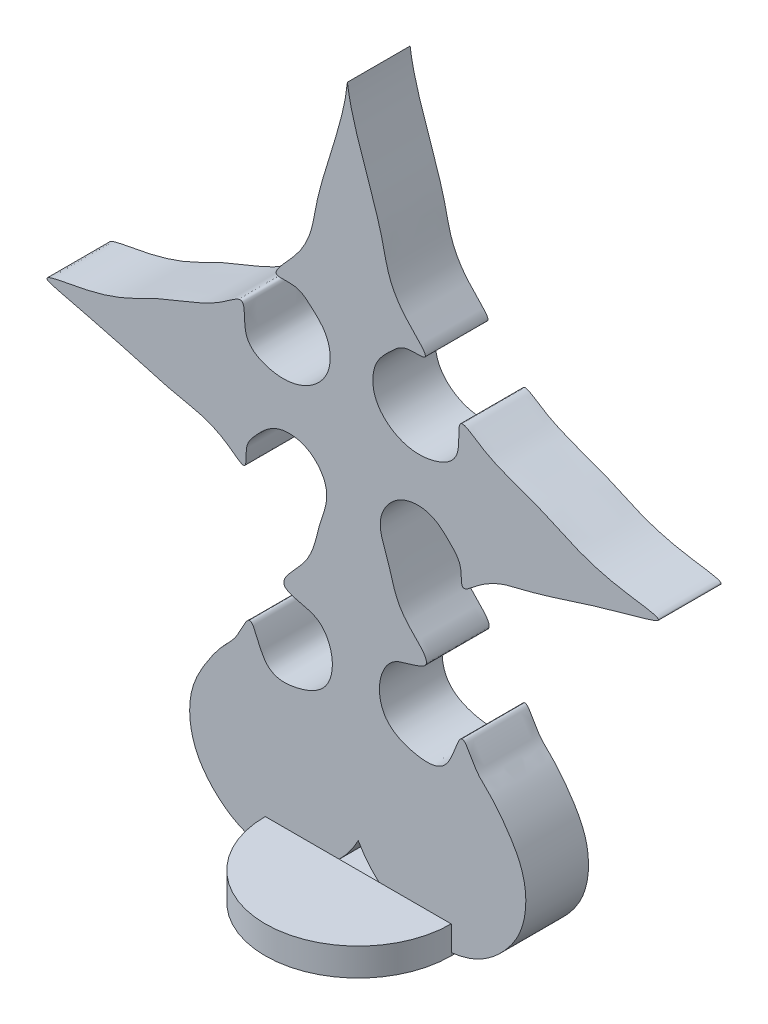
ISO-10303-21;
HEADER;
FILE_DESCRIPTION(('STEP AP214'),'2;1');
FILE_NAME('part.step','',(''),(''),'','','');
FILE_SCHEMA(('AUTOMOTIVE_DESIGN { 1 0 10303 214 1 1 1 1 }'));
ENDSEC;
DATA;
#1=APPLICATION_CONTEXT('core data for automotive mechanical design processes');
#2=APPLICATION_PROTOCOL_DEFINITION('international standard','automotive_design',2000,#1);
#3=PRODUCT_CONTEXT('',#1,'mechanical');
#4=PRODUCT('Part','Part','',(#3));
#5=PRODUCT_RELATED_PRODUCT_CATEGORY('part','',(#4));
#6=PRODUCT_DEFINITION_FORMATION('','',#4);
#7=PRODUCT_DEFINITION_CONTEXT('part definition',#1,'design');
#8=PRODUCT_DEFINITION('design','',#6,#7);
#9=PRODUCT_DEFINITION_SHAPE('','',#8);
#10=(LENGTH_UNIT() NAMED_UNIT(*) SI_UNIT(.MILLI.,.METRE.));
#11=(NAMED_UNIT(*) PLANE_ANGLE_UNIT() SI_UNIT($,.RADIAN.));
#12=(NAMED_UNIT(*) SI_UNIT($,.STERADIAN.) SOLID_ANGLE_UNIT());
#13=UNCERTAINTY_MEASURE_WITH_UNIT(LENGTH_MEASURE(1.E-05),#10,'distance_accuracy_value','');
#14=(GEOMETRIC_REPRESENTATION_CONTEXT(3) GLOBAL_UNCERTAINTY_ASSIGNED_CONTEXT((#13)) GLOBAL_UNIT_ASSIGNED_CONTEXT((#10,
#11,#12)) REPRESENTATION_CONTEXT('',''));
#15=CARTESIAN_POINT('',(0.,0.,0.));
#16=DIRECTION('',(0.,0.,1.));
#17=DIRECTION('',(1.,0.,0.));
#18=AXIS2_PLACEMENT_3D('',#15,#16,#17);
#19=CARTESIAN_POINT('',(-2.3460589924992,67.9005937561883,9.49282314499069));
#20=CARTESIAN_POINT('',(-2.95517138806825,61.44575257262,9.49282314499069));
#21=CARTESIAN_POINT('',(-7.75262932540256,50.6532373488072,9.49282314499069));
#22=CARTESIAN_POINT('',(-8.31635708686158,40.6967952727201,9.49282314499069));
#23=CARTESIAN_POINT('',(-16.0326186965979,33.7697083925186,9.49282314499069));
#24=CARTESIAN_POINT('',(-10.6596714627427,34.7837020859185,9.49282314499069));
#25=CARTESIAN_POINT('',(-8.25497269371805,32.6938123368539,9.49282314499069));
#26=CARTESIAN_POINT('',(-5.24318254140123,30.0194877075942,9.49282314499069));
#27=CARTESIAN_POINT('',(-4.76314986308724,24.2618958431138,9.49282314499069));
#28=CARTESIAN_POINT('',(-9.65646749749868,20.0113175271098,9.49282314499069));
#29=CARTESIAN_POINT('',(-15.4052762966303,20.0134316688476,9.49282314499069));
#30=CARTESIAN_POINT('',(-20.0454718472213,22.6736930282064,9.49282314499069));
#31=CARTESIAN_POINT('',(-18.846763472696,29.1020712023789,9.49282314499069));
#32=CARTESIAN_POINT('',(-22.2944338381779,26.5961578421053,9.49282314499069));
#33=CARTESIAN_POINT('',(-25.9790619184153,24.1569941839957,9.49282314499069));
#34=CARTESIAN_POINT('',(-35.5778296219317,20.9877590064459,9.49282314499069));
#35=CARTESIAN_POINT('',(-40.5608869217253,17.0166202355323,9.49282314499069));
#36=CARTESIAN_POINT('',(-53.9991171827852,15.2082508813477,9.49282314499069));
#37=CARTESIAN_POINT('',(-46.8511070189001,13.3281049855076,9.49282314499069));
#38=CARTESIAN_POINT('',(-40.7285629715687,11.9895822215769,9.49282314499069));
#39=CARTESIAN_POINT('',(-30.4169189947871,8.71529616806468,9.49282314499069));
#40=CARTESIAN_POINT('',(-24.1233274225736,8.02645548076703,9.49282314499069));
#41=CARTESIAN_POINT('',(-18.760459039084,3.41760152861572,9.49282314499069));
#42=CARTESIAN_POINT('',(-19.4146522292287,7.55519954047403,9.49282314499069));
#43=CARTESIAN_POINT('',(-17.4055458858435,9.93819061450821,9.49282314499069));
#44=CARTESIAN_POINT('',(-14.3688746332141,13.1109242453668,9.49282314499069));
#45=CARTESIAN_POINT('',(-8.57714751449055,12.9204303028617,9.49282314499069));
#46=CARTESIAN_POINT('',(-4.75067469868509,7.74290027555642,9.49282314499069));
#47=CARTESIAN_POINT('',(-7.53272910327,1.48990688220436,9.49282314499069));
#48=CARTESIAN_POINT('',(-7.87635932891367,-3.86950174734833,9.49282314499069));
#49=CARTESIAN_POINT('',(-14.3539229360303,-9.09320879055618,9.49282314499069));
#50=CARTESIAN_POINT('',(-10.158580388337,-10.639284984728,9.49282314499069));
#51=CARTESIAN_POINT('',(-6.88803800389209,-10.9751819628141,9.49282314499069));
#52=CARTESIAN_POINT('',(-4.39249541563236,-15.2966792667442,9.49282314499069));
#53=CARTESIAN_POINT('',(-5.14179829311079,-20.8157309231323,9.49282314499069));
#54=CARTESIAN_POINT('',(-10.3066659966604,-23.26615594529,9.49282314499069));
#55=CARTESIAN_POINT('',(-16.5020559749116,-23.6094956543746,9.49282314499069));
#56=CARTESIAN_POINT('',(-18.164327804651,-14.5949931650333,9.49282314499069));
#57=CARTESIAN_POINT('',(-20.41086585346,-20.7353385709205,9.49282314499069));
#58=CARTESIAN_POINT('',(-23.1481927863914,-23.1393014786118,9.49282314499069));
#59=CARTESIAN_POINT('',(-25.8440120500354,-26.8941989256743,9.49282314499069));
#60=CARTESIAN_POINT('',(-28.9497919183617,-32.6196925295249,9.49282314499069));
#61=CARTESIAN_POINT('',(-28.3333224921047,-39.4285643996658,9.49282314499069));
#62=CARTESIAN_POINT('',(-24.4267103699395,-44.8132575699436,9.49282314499069));
#63=CARTESIAN_POINT('',(-19.2840323061421,-48.6092180527872,9.49282314499069));
#64=CARTESIAN_POINT('',(-9.12058171939275,-49.0537249038754,9.49282314499069));
#65=CARTESIAN_POINT('',(-2.83964059129099,-44.1279717064814,9.49282314499069));
#66=CARTESIAN_POINT('',(-0.553360487767509,-39.7685000475549,9.49282314499069));
#67=B_SPLINE_CURVE_WITH_KNOTS('',3,(#19,#20,#21,#22,#23,#24,#25,#26,#27,#28,#29,#30,#31,#32,#33,
#34,#35,#36,#37,#38,#39,#40,#41,#42,#43,#44,#45,#46,#47,#48,#49,#50,#51,#52,#53,#54,#55,#56,#57,
#58,#59,#60,#61,#62,#63,#64,#65,#66),.UNSPECIFIED.,.F.,.F.,(4,1,1,1,1,1,1,1,1,1,1,1,1,1,1,1,1,1,
1,1,1,1,1,1,1,1,1,1,1,1,1,1,1,1,1,1,1,1,1,1,1,1,1,1,1,4),(0.,0.0765296821283556,
0.113414589574805,0.132065125705345,0.143599622220985,0.153788714775399,0.168043167292344,
0.187000188152719,0.209756573885791,0.230991430578766,0.248039111833486,0.264030224740001,
0.2726285947956,0.282667091317777,0.318472625841475,0.371554920982243,0.392293526376204,
0.40055495641139,0.433977221648148,0.476274052367464,0.509204969417728,0.519210248422387,
0.528722924724852,0.539401242741352,0.555356275733937,0.574920279468608,0.595566115081646,
0.615350689585335,0.64406330472733,0.66453719826346,0.670866191653329,0.686337270739187,
0.701033441042022,0.720566688879891,0.740691602784677,0.760142601422091,0.78078938578986,
0.79598399469926,0.806285905121674,0.824905609733505,0.845555733337902,0.878429634344527,
0.893067037271574,0.919085146474658,0.946418220082022,1.),.UNSPECIFIED.);
#68=DIRECTION('',(0.,0.,-1.));
#69=VECTOR('',#68,1.);
#70=SURFACE_OF_LINEAR_EXTRUSION('',#67,#69);
#71=CARTESIAN_POINT('',(-2.3460589924992,67.9005937561883,-0.870376855009304));
#72=CARTESIAN_POINT('',(-2.95517138806825,61.44575257262,-0.870376855009304));
#73=CARTESIAN_POINT('',(-7.75262932540256,50.6532373488072,-0.870376855009304));
#74=CARTESIAN_POINT('',(-8.31635708686158,40.6967952727201,-0.870376855009304));
#75=CARTESIAN_POINT('',(-16.0326186965979,33.7697083925186,-0.870376855009304));
#76=CARTESIAN_POINT('',(-10.6596714627427,34.7837020859185,-0.870376855009304));
#77=CARTESIAN_POINT('',(-8.25497269371805,32.6938123368539,-0.870376855009304));
#78=CARTESIAN_POINT('',(-5.24318254140123,30.0194877075942,-0.870376855009304));
#79=CARTESIAN_POINT('',(-4.76314986308724,24.2618958431138,-0.870376855009304));
#80=CARTESIAN_POINT('',(-9.65646749749868,20.0113175271098,-0.870376855009304));
#81=CARTESIAN_POINT('',(-15.4052762966303,20.0134316688476,-0.870376855009304));
#82=CARTESIAN_POINT('',(-20.0454718472213,22.6736930282064,-0.870376855009304));
#83=CARTESIAN_POINT('',(-18.846763472696,29.1020712023789,-0.870376855009304));
#84=CARTESIAN_POINT('',(-22.2944338381779,26.5961578421053,-0.870376855009304));
#85=CARTESIAN_POINT('',(-25.9790619184153,24.1569941839957,-0.870376855009304));
#86=CARTESIAN_POINT('',(-35.5778296219317,20.9877590064459,-0.870376855009304));
#87=CARTESIAN_POINT('',(-40.5608869217253,17.0166202355323,-0.870376855009304));
#88=CARTESIAN_POINT('',(-53.9991171827852,15.2082508813477,-0.870376855009304));
#89=CARTESIAN_POINT('',(-46.8511070189001,13.3281049855076,-0.870376855009304));
#90=CARTESIAN_POINT('',(-40.7285629715687,11.9895822215769,-0.870376855009304));
#91=CARTESIAN_POINT('',(-30.4169189947871,8.71529616806468,-0.870376855009304));
#92=CARTESIAN_POINT('',(-24.1233274225736,8.02645548076703,-0.870376855009304));
#93=CARTESIAN_POINT('',(-18.760459039084,3.41760152861572,-0.870376855009304));
#94=CARTESIAN_POINT('',(-19.4146522292287,7.55519954047403,-0.870376855009304));
#95=CARTESIAN_POINT('',(-17.4055458858435,9.93819061450821,-0.870376855009304));
#96=CARTESIAN_POINT('',(-14.3688746332141,13.1109242453668,-0.870376855009304));
#97=CARTESIAN_POINT('',(-8.57714751449055,12.9204303028617,-0.870376855009304));
#98=CARTESIAN_POINT('',(-4.75067469868509,7.74290027555642,-0.870376855009304));
#99=CARTESIAN_POINT('',(-7.53272910327,1.48990688220436,-0.870376855009304));
#100=CARTESIAN_POINT('',(-7.87635932891367,-3.86950174734833,-0.870376855009304));
#101=CARTESIAN_POINT('',(-14.3539229360303,-9.09320879055618,-0.870376855009304));
#102=CARTESIAN_POINT('',(-10.158580388337,-10.639284984728,-0.870376855009304));
#103=CARTESIAN_POINT('',(-6.88803800389209,-10.9751819628141,-0.870376855009304));
#104=CARTESIAN_POINT('',(-4.39249541563236,-15.2966792667442,-0.870376855009304));
#105=CARTESIAN_POINT('',(-5.14179829311079,-20.8157309231323,-0.870376855009304));
#106=CARTESIAN_POINT('',(-10.3066659966604,-23.26615594529,-0.870376855009304));
#107=CARTESIAN_POINT('',(-16.5020559749116,-23.6094956543746,-0.870376855009304));
#108=CARTESIAN_POINT('',(-18.164327804651,-14.5949931650333,-0.870376855009304));
#109=CARTESIAN_POINT('',(-20.41086585346,-20.7353385709205,-0.870376855009304));
#110=CARTESIAN_POINT('',(-23.1481927863914,-23.1393014786118,-0.870376855009304));
#111=CARTESIAN_POINT('',(-25.8440120500354,-26.8941989256743,-0.870376855009304));
#112=CARTESIAN_POINT('',(-28.9497919183617,-32.6196925295249,-0.870376855009304));
#113=CARTESIAN_POINT('',(-28.3333224921047,-39.4285643996658,-0.870376855009304));
#114=CARTESIAN_POINT('',(-24.4267103699395,-44.8132575699436,-0.870376855009304));
#115=CARTESIAN_POINT('',(-19.2840323061421,-48.6092180527872,-0.870376855009304));
#116=CARTESIAN_POINT('',(-9.12058171939275,-49.0537249038754,-0.870376855009304));
#117=CARTESIAN_POINT('',(-2.83964059129099,-44.1279717064814,-0.870376855009304));
#118=CARTESIAN_POINT('',(-0.553360487767509,-39.7685000475549,-0.870376855009304));
#119=B_SPLINE_CURVE_WITH_KNOTS('',3,(#71,#72,#73,#74,#75,#76,#77,#78,#79,#80,#81,#82,#83,#84,
#85,#86,#87,#88,#89,#90,#91,#92,#93,#94,#95,#96,#97,#98,#99,#100,#101,#102,#103,#104,#105,#106,
#107,#108,#109,#110,#111,#112,#113,#114,#115,#116,#117,#118),.UNSPECIFIED.,.F.,.F.,(4,1,1,1,1,1,
1,1,1,1,1,1,1,1,1,1,1,1,1,1,1,1,1,1,1,1,1,1,1,1,1,1,1,1,1,1,1,1,1,1,1,1,1,1,1,4),(0.,
0.0765296821283556,0.113414589574805,0.132065125705345,0.143599622220985,0.153788714775399,
0.168043167292344,0.187000188152719,0.209756573885791,0.230991430578766,0.248039111833486,
0.264030224740001,0.2726285947956,0.282667091317777,0.318472625841475,0.371554920982243,
0.392293526376204,0.40055495641139,0.433977221648148,0.476274052367464,0.509204969417728,
0.519210248422387,0.528722924724852,0.539401242741352,0.555356275733937,0.574920279468608,
0.595566115081646,0.615350689585335,0.64406330472733,0.66453719826346,0.670866191653329,
0.686337270739187,0.701033441042022,0.720566688879891,0.740691602784677,0.760142601422091,
0.78078938578986,0.79598399469926,0.806285905121674,0.824905609733505,0.845555733337902,
0.878429634344527,0.893067037271574,0.919085146474658,0.946418220082022,1.),.UNSPECIFIED.);
#120=CARTESIAN_POINT('',(-2.3460589924992,67.9005937561883,-0.870376855009304));
#121=VERTEX_POINT('',#120);
#122=CARTESIAN_POINT('',(-15.9251427975306,-48.5773518851356,-0.870376855009304));
#123=VERTEX_POINT('',#122);
#124=EDGE_CURVE('E221',#121,#123,#119,.T.);
#125=ORIENTED_EDGE('',*,*,#124,.T.);
#126=CARTESIAN_POINT('',(-13.407806116502,-48.5773518851357,-0.870376855009521));
#127=VERTEX_POINT('',#126);
#128=EDGE_CURVE('E282',#123,#127,#119,.T.);
#129=ORIENTED_EDGE('',*,*,#128,.T.);
#130=DIRECTION('',(0.,0.,-1.));
#131=VECTOR('',#130,1.);
#132=CARTESIAN_POINT('',(-13.4078061165021,-48.5773518851357,9.49282314499069));
#133=LINE('',#132,#131);
#134=CARTESIAN_POINT('',(-13.4078061165019,-48.5773518851357,9.49282314499046));
#135=VERTEX_POINT('',#134);
#136=EDGE_CURVE('E172',#135,#127,#133,.T.);
#137=ORIENTED_EDGE('',*,*,#136,.F.);
#138=CARTESIAN_POINT('',(-15.9251427975306,-48.5773518851357,9.49282314499041));
#139=VERTEX_POINT('',#138);
#140=EDGE_CURVE('E207',#139,#135,#67,.T.);
#141=ORIENTED_EDGE('',*,*,#140,.F.);
#142=CARTESIAN_POINT('',(-2.3460589924992,67.9005937561883,9.49282314499069));
#143=VERTEX_POINT('',#142);
#144=EDGE_CURVE('E199',#143,#139,#67,.T.);
#145=ORIENTED_EDGE('',*,*,#144,.F.);
#146=DIRECTION('',(0.,0.,-1.));
#147=VECTOR('',#146,1.);
#148=CARTESIAN_POINT('',(-2.3460589924992,67.9005937561883,9.49282314499069));
#149=LINE('',#148,#147);
#150=EDGE_CURVE('E219',#143,#121,#149,.T.);
#151=ORIENTED_EDGE('',*,*,#150,.T.);
#152=EDGE_LOOP('',(#125,#129,#137,#141,#145,#151));
#153=FACE_BOUND('',#152,.T.);
#154=ADVANCED_FACE('F45',(#153),#70,.F.);
#155=DIRECTION('',(0.,0.,-1.));
#156=VECTOR('',#155,1.);
#157=CARTESIAN_POINT('',(-8.78408665780589,-47.416833090648,9.49282314499069));
#158=LINE('',#157,#156);
#159=CARTESIAN_POINT('',(-8.78408665812589,-47.416833090648,-0.870376855009436));
#160=VERTEX_POINT('',#159);
#161=CARTESIAN_POINT('',(-8.7840866583285,-47.4168330908702,9.49282314499069));
#162=VERTEX_POINT('',#161);
#163=EDGE_CURVE('E61',#160,#162,#158,.F.);
#164=ORIENTED_EDGE('',*,*,#163,.F.);
#165=CARTESIAN_POINT('',(-3.98597350833919,-44.2753961408109,-0.870376855009354));
#166=VERTEX_POINT('',#165);
#167=EDGE_CURVE('E289',#160,#166,#119,.T.);
#168=ORIENTED_EDGE('',*,*,#167,.T.);
#169=CARTESIAN_POINT('',(-0.553360487767512,-39.7685000475549,-0.870376855009304));
#170=VERTEX_POINT('',#169);
#171=EDGE_CURVE('E181',#166,#170,#119,.T.);
#172=ORIENTED_EDGE('',*,*,#171,.T.);
#173=DIRECTION('',(0.,0.,-1.));
#174=VECTOR('',#173,1.);
#175=CARTESIAN_POINT('',(-0.553360487767512,-39.7685000475549,9.49282314499069));
#176=LINE('',#175,#174);
#177=CARTESIAN_POINT('',(-0.553360487767512,-39.7685000475549,9.49282314499069));
#178=VERTEX_POINT('',#177);
#179=EDGE_CURVE('E302',#178,#170,#176,.T.);
#180=ORIENTED_EDGE('',*,*,#179,.F.);
#181=CARTESIAN_POINT('',(-3.6979721949237,-43.9991877911426,9.49282314499069));
#182=VERTEX_POINT('',#181);
#183=EDGE_CURVE('E310',#182,#178,#67,.T.);
#184=ORIENTED_EDGE('',*,*,#183,.F.);
#185=EDGE_CURVE('E208',#162,#182,#67,.T.);
#186=ORIENTED_EDGE('',*,*,#185,.F.);
#187=EDGE_LOOP('',(#164,#168,#172,#180,#184,#186));
#188=FACE_BOUND('',#187,.T.);
#189=ADVANCED_FACE('F232',(#188),#70,.F.);
#190=CARTESIAN_POINT('',(-0.553360487767512,-39.7685000475549,9.49282314499069));
#191=CARTESIAN_POINT('',(1.8767831667633,-44.0494428964019,9.49282314499069));
#192=CARTESIAN_POINT('',(8.31822565398662,-48.7633674503285,9.49282314499069));
#193=CARTESIAN_POINT('',(18.4612446346859,-47.9807563546156,9.49282314499069));
#194=CARTESIAN_POINT('',(23.4747011093336,-44.0156954683254,9.49282314499069));
#195=CARTESIAN_POINT('',(27.1998864143878,-38.5039322972439,9.49282314499069));
#196=CARTESIAN_POINT('',(27.5893405166444,-31.6783117247434,9.49282314499069));
#197=CARTESIAN_POINT('',(24.294675214033,-26.0593860140755,9.49282314499069));
#198=CARTESIAN_POINT('',(21.4753462379188,-22.3963161997487,9.49282314499069));
#199=CARTESIAN_POINT('',(18.6595064554349,-20.0848139352703,9.49282314499069));
#200=CARTESIAN_POINT('',(16.2097958990708,-14.0226614216507,9.49282314499069));
#201=CARTESIAN_POINT('',(14.8485465530355,-23.0875057658302,9.49282314499069));
#202=CARTESIAN_POINT('',(8.64516056156319,-22.95060660859,9.49282314499069));
#203=CARTESIAN_POINT('',(3.40157881883426,-20.6734830520593,9.49282314499069));
#204=CARTESIAN_POINT('',(2.4689569631132,-15.1824355689001,9.49282314499069));
#205=CARTESIAN_POINT('',(4.81924965480526,-10.7802547433238,9.49282314499069));
#206=CARTESIAN_POINT('',(8.07679686972617,-10.3356645827273,9.49282314499069));
#207=CARTESIAN_POINT('',(12.2183436535634,-8.65077855454688,9.49282314499069));
#208=CARTESIAN_POINT('',(5.57046851642787,-3.64561105299861,9.49282314499069));
#209=CARTESIAN_POINT('',(5.04860911310992,1.69938710917778,9.49282314499069));
#210=CARTESIAN_POINT('',(2.05992888044651,7.85629733706493,9.49282314499069));
#211=CARTESIAN_POINT('',(5.71191595194468,13.158344283609,9.49282314499069));
#212=CARTESIAN_POINT('',(11.494091018678,13.5415445674491,9.49282314499069));
#213=CARTESIAN_POINT('',(14.6347022810056,10.4716631547772,9.49282314499069));
#214=CARTESIAN_POINT('',(16.7220269522888,8.15687796504366,9.49282314499069));
#215=CARTESIAN_POINT('',(16.2059408286267,3.99979471464694,9.49282314499069));
#216=CARTESIAN_POINT('',(21.4124035998039,8.78462882496251,9.49282314499069));
#217=CARTESIAN_POINT('',(27.6795745161592,9.68260715181894,9.49282314499069));
#218=CARTESIAN_POINT('',(37.8764987872445,13.2983624081755,9.49282314499069));
#219=CARTESIAN_POINT('',(43.9510884748821,14.8399683655856,9.49282314499069));
#220=CARTESIAN_POINT('',(51.0325447339234,16.9570359469189,9.49282314499069));
#221=CARTESIAN_POINT('',(37.5415609529619,18.3170318631815,9.49282314499069));
#222=CARTESIAN_POINT('',(32.4290628754886,22.1200788782357,9.49282314499069));
#223=CARTESIAN_POINT('',(22.7301089750608,24.9680055405752,9.49282314499069));
#224=CARTESIAN_POINT('',(18.9663212654206,27.2831525159265,9.49282314499069));
#225=CARTESIAN_POINT('',(15.4371377666633,29.6729007349484,9.49282314499069));
#226=CARTESIAN_POINT('',(16.8491883331056,23.2879918933795,9.49282314499069));
#227=CARTESIAN_POINT('',(12.3001273773584,20.4747287224838,9.49282314499069));
#228=CARTESIAN_POINT('',(6.55457550363634,20.2812326115745,9.49282314499069));
#229=CARTESIAN_POINT('',(1.52246454928648,24.3665517955352,9.49282314499069));
#230=CARTESIAN_POINT('',(1.81055560987381,30.136932978004,9.49282314499069));
#231=CARTESIAN_POINT('',(4.73164560729022,32.9100405076991,9.49282314499069));
#232=CARTESIAN_POINT('',(7.06543710552131,35.07882647588,9.49282314499069));
#233=CARTESIAN_POINT('',(12.4691629185818,34.244265198735,9.49282314499069));
#234=CARTESIAN_POINT('',(4.5265693005793,40.9106309624038,9.49282314499069));
#235=CARTESIAN_POINT('',(3.63169488223719,50.842787202562,9.49282314499069));
#236=CARTESIAN_POINT('',(-1.52239661615724,61.4696083802662,9.49282314499069));
#237=CARTESIAN_POINT('',(-2.3460589924992,67.9005937561883,9.49282314499069));
#238=B_SPLINE_CURVE_WITH_KNOTS('',3,(#190,#191,#192,#193,#194,#195,#196,#197,#198,#199,#200,
#201,#202,#203,#204,#205,#206,#207,#208,#209,#210,#211,#212,#213,#214,#215,#216,#217,#218,#219,
#220,#221,#222,#223,#224,#225,#226,#227,#228,#229,#230,#231,#232,#233,#234,#235,#236,#237),
.UNSPECIFIED.,.F.,.F.,(4,1,1,1,1,1,1,1,1,1,1,1,1,1,1,1,1,1,1,1,1,1,1,1,1,1,1,1,1,1,1,1,1,1,1,1,
1,1,1,1,1,1,1,1,1,4),(0.,0.0535817799179782,0.0809148535253418,0.106932962728426,
0.121570365655473,0.154444266662098,0.175094390266495,0.193714094878326,0.20401600530074,
0.21921061421014,0.239857398577909,0.259308397215323,0.279433311120109,0.298966558957978,
0.313662729260813,0.329133808346671,0.335462801736539,0.35593669527267,0.384649310414664,
0.404433884918354,0.425079720531392,0.444643724266063,0.460598757258648,0.471277075275148,
0.480789751577613,0.490795030582272,0.523725947632536,0.566022778351853,0.59944504358861,
0.607706473623796,0.628445079017757,0.681527374158525,0.717332908682223,0.7273714052044,
0.735969775259999,0.751960888166514,0.769008569421234,0.790243426114209,0.812999811847281,
0.831956832707656,0.846211285224601,0.856400377779015,0.867934874294655,0.886585410425195,
0.923470317871644,1.),.UNSPECIFIED.);
#239=DIRECTION('',(0.,0.,-1.));
#240=VECTOR('',#239,1.);
#241=SURFACE_OF_LINEAR_EXTRUSION('',#238,#240);
#242=DIRECTION('',(0.,0.,-1.));
#243=VECTOR('',#242,1.);
#244=CARTESIAN_POINT('',(8.70825506021477,-47.416833090648,9.49282314499069));
#245=LINE('',#244,#243);
#246=CARTESIAN_POINT('',(8.70825508701079,-47.416833090648,9.49282314499087));
#247=VERTEX_POINT('',#246);
#248=CARTESIAN_POINT('',(8.70825507481158,-47.416833090648,-0.870376855009111));
#249=VERTEX_POINT('',#248);
#250=EDGE_CURVE('E334',#247,#249,#245,.T.);
#251=ORIENTED_EDGE('',*,*,#250,.F.);
#252=CARTESIAN_POINT('',(2.8479809657701,-43.9991877911354,9.49282314499076));
#253=VERTEX_POINT('',#252);
#254=EDGE_CURVE('E220',#253,#247,#238,.T.);
#255=ORIENTED_EDGE('',*,*,#254,.F.);
#256=EDGE_CURVE('E209',#178,#253,#238,.T.);
#257=ORIENTED_EDGE('',*,*,#256,.F.);
#258=ORIENTED_EDGE('',*,*,#179,.T.);
#259=CARTESIAN_POINT('',(-0.553360487767512,-39.7685000475549,-0.870376855009304));
#260=CARTESIAN_POINT('',(1.8767831667633,-44.0494428964019,-0.870376855009304));
#261=CARTESIAN_POINT('',(8.31822565398662,-48.7633674503285,-0.870376855009304));
#262=CARTESIAN_POINT('',(18.4612446346859,-47.9807563546156,-0.870376855009304));
#263=CARTESIAN_POINT('',(23.4747011093336,-44.0156954683254,-0.870376855009304));
#264=CARTESIAN_POINT('',(27.1998864143878,-38.5039322972439,-0.870376855009304));
#265=CARTESIAN_POINT('',(27.5893405166444,-31.6783117247434,-0.870376855009304));
#266=CARTESIAN_POINT('',(24.294675214033,-26.0593860140755,-0.870376855009304));
#267=CARTESIAN_POINT('',(21.4753462379188,-22.3963161997487,-0.870376855009304));
#268=CARTESIAN_POINT('',(18.6595064554349,-20.0848139352703,-0.870376855009304));
#269=CARTESIAN_POINT('',(16.2097958990708,-14.0226614216507,-0.870376855009304));
#270=CARTESIAN_POINT('',(14.8485465530355,-23.0875057658302,-0.870376855009304));
#271=CARTESIAN_POINT('',(8.64516056156319,-22.95060660859,-0.870376855009304));
#272=CARTESIAN_POINT('',(3.40157881883426,-20.6734830520593,-0.870376855009304));
#273=CARTESIAN_POINT('',(2.4689569631132,-15.1824355689001,-0.870376855009304));
#274=CARTESIAN_POINT('',(4.81924965480526,-10.7802547433238,-0.870376855009304));
#275=CARTESIAN_POINT('',(8.07679686972617,-10.3356645827273,-0.870376855009304));
#276=CARTESIAN_POINT('',(12.2183436535634,-8.65077855454688,-0.870376855009304));
#277=CARTESIAN_POINT('',(5.57046851642787,-3.64561105299861,-0.870376855009304));
#278=CARTESIAN_POINT('',(5.04860911310992,1.69938710917778,-0.870376855009304));
#279=CARTESIAN_POINT('',(2.05992888044651,7.85629733706493,-0.870376855009304));
#280=CARTESIAN_POINT('',(5.71191595194468,13.158344283609,-0.870376855009304));
#281=CARTESIAN_POINT('',(11.494091018678,13.5415445674491,-0.870376855009304));
#282=CARTESIAN_POINT('',(14.6347022810056,10.4716631547772,-0.870376855009304));
#283=CARTESIAN_POINT('',(16.7220269522888,8.15687796504366,-0.870376855009304));
#284=CARTESIAN_POINT('',(16.2059408286267,3.99979471464694,-0.870376855009304));
#285=CARTESIAN_POINT('',(21.4124035998039,8.78462882496251,-0.870376855009304));
#286=CARTESIAN_POINT('',(27.6795745161592,9.68260715181894,-0.870376855009304));
#287=CARTESIAN_POINT('',(37.8764987872445,13.2983624081755,-0.870376855009304));
#288=CARTESIAN_POINT('',(43.9510884748821,14.8399683655856,-0.870376855009304));
#289=CARTESIAN_POINT('',(51.0325447339234,16.9570359469189,-0.870376855009304));
#290=CARTESIAN_POINT('',(37.5415609529619,18.3170318631815,-0.870376855009304));
#291=CARTESIAN_POINT('',(32.4290628754886,22.1200788782357,-0.870376855009304));
#292=CARTESIAN_POINT('',(22.7301089750608,24.9680055405752,-0.870376855009304));
#293=CARTESIAN_POINT('',(18.9663212654206,27.2831525159265,-0.870376855009304));
#294=CARTESIAN_POINT('',(15.4371377666633,29.6729007349484,-0.870376855009304));
#295=CARTESIAN_POINT('',(16.8491883331056,23.2879918933795,-0.870376855009304));
#296=CARTESIAN_POINT('',(12.3001273773584,20.4747287224838,-0.870376855009304));
#297=CARTESIAN_POINT('',(6.55457550363634,20.2812326115745,-0.870376855009304));
#298=CARTESIAN_POINT('',(1.52246454928648,24.3665517955352,-0.870376855009304));
#299=CARTESIAN_POINT('',(1.81055560987381,30.136932978004,-0.870376855009304));
#300=CARTESIAN_POINT('',(4.73164560729022,32.9100405076991,-0.870376855009304));
#301=CARTESIAN_POINT('',(7.06543710552131,35.07882647588,-0.870376855009304));
#302=CARTESIAN_POINT('',(12.4691629185818,34.244265198735,-0.870376855009304));
#303=CARTESIAN_POINT('',(4.5265693005793,40.9106309624038,-0.870376855009304));
#304=CARTESIAN_POINT('',(3.63169488223719,50.842787202562,-0.870376855009304));
#305=CARTESIAN_POINT('',(-1.52239661615724,61.4696083802662,-0.870376855009304));
#306=CARTESIAN_POINT('',(-2.3460589924992,67.9005937561883,-0.870376855009304));
#307=B_SPLINE_CURVE_WITH_KNOTS('',3,(#259,#260,#261,#262,#263,#264,#265,#266,#267,#268,#269,
#270,#271,#272,#273,#274,#275,#276,#277,#278,#279,#280,#281,#282,#283,#284,#285,#286,#287,#288,
#289,#290,#291,#292,#293,#294,#295,#296,#297,#298,#299,#300,#301,#302,#303,#304,#305,#306),
.UNSPECIFIED.,.F.,.F.,(4,1,1,1,1,1,1,1,1,1,1,1,1,1,1,1,1,1,1,1,1,1,1,1,1,1,1,1,1,1,1,1,1,1,1,1,
1,1,1,1,1,1,1,1,1,4),(0.,0.0535817799179782,0.0809148535253418,0.106932962728426,
0.121570365655473,0.154444266662098,0.175094390266495,0.193714094878326,0.20401600530074,
0.21921061421014,0.239857398577909,0.259308397215323,0.279433311120109,0.298966558957978,
0.313662729260813,0.329133808346671,0.335462801736539,0.35593669527267,0.384649310414664,
0.404433884918354,0.425079720531392,0.444643724266063,0.460598757258648,0.471277075275148,
0.480789751577613,0.490795030582272,0.523725947632536,0.566022778351853,0.59944504358861,
0.607706473623796,0.628445079017757,0.681527374158525,0.717332908682223,0.7273714052044,
0.735969775259999,0.751960888166514,0.769008569421234,0.790243426114209,0.812999811847281,
0.831956832707656,0.846211285224601,0.856400377779015,0.867934874294655,0.886585410425195,
0.923470317871644,1.),.UNSPECIFIED.);
#308=CARTESIAN_POINT('',(3.16209549883426,-44.27539614082,-0.870376855009304));
#309=VERTEX_POINT('',#308);
#310=EDGE_CURVE('E293',#170,#309,#307,.T.);
#311=ORIENTED_EDGE('',*,*,#310,.T.);
#312=EDGE_CURVE('E292',#309,#249,#307,.T.);
#313=ORIENTED_EDGE('',*,*,#312,.T.);
#314=EDGE_LOOP('',(#251,#255,#257,#258,#311,#313));
#315=FACE_BOUND('',#314,.T.);
#316=ADVANCED_FACE('F228',(#315),#241,.F.);
#317=DIRECTION('',(0.,0.,-1.));
#318=VECTOR('',#317,1.);
#319=CARTESIAN_POINT('',(14.818421822002,-48.0926422750259,9.4928231449907));
#320=LINE('',#319,#318);
#321=CARTESIAN_POINT('',(14.8184218219949,-48.0926422750265,-0.870376855008998));
#322=VERTEX_POINT('',#321);
#323=CARTESIAN_POINT('',(14.8184218219948,-48.0926422750265,9.49282314499069));
#324=VERTEX_POINT('',#323);
#325=EDGE_CURVE('E167',#322,#324,#320,.F.);
#326=ORIENTED_EDGE('',*,*,#325,.F.);
#327=EDGE_CURVE('E288',#322,#121,#307,.T.);
#328=ORIENTED_EDGE('',*,*,#327,.T.);
#329=ORIENTED_EDGE('',*,*,#150,.F.);
#330=EDGE_CURVE('E206',#324,#143,#238,.T.);
#331=ORIENTED_EDGE('',*,*,#330,.F.);
#332=EDGE_LOOP('',(#326,#328,#329,#331));
#333=FACE_BOUND('',#332,.T.);
#334=ADVANCED_FACE('F231',(#333),#241,.F.);
#335=CARTESIAN_POINT('',(-1.32412814819236,1.54540970637527,-0.870376855009315));
#336=DIRECTION('',(0.,0.,1.));
#337=DIRECTION('',(1.,0.,0.));
#338=AXIS2_PLACEMENT_3D('',#335,#336,#337);
#339=PLANE('',#338);
#340=ORIENTED_EDGE('',*,*,#167,.F.);
#341=DIRECTION('',(1.,0.,0.));
#342=VECTOR('',#341,1.);
#343=CARTESIAN_POINT('',(-15.9251427975305,-47.416833090648,-0.870376855009568));
#344=LINE('',#343,#342);
#345=EDGE_CURVE('E168',#160,#249,#344,.T.);
#346=ORIENTED_EDGE('',*,*,#345,.T.);
#347=ORIENTED_EDGE('',*,*,#312,.F.);
#348=DIRECTION('',(-1.,0.,0.));
#349=VECTOR('',#348,1.);
#350=CARTESIAN_POINT('',(-0.553360487767513,-44.2753961408109,-0.870376855009304));
#351=LINE('',#350,#349);
#352=EDGE_CURVE('E188',#309,#166,#351,.T.);
#353=ORIENTED_EDGE('',*,*,#352,.T.);
#354=EDGE_LOOP('',(#340,#346,#347,#353));
#355=FACE_BOUND('',#354,.T.);
#356=ADVANCED_FACE('F251',(#355),#339,.T.);
#357=CARTESIAN_POINT('',(-1.32412814819309,1.54540970637527,9.49282314499068));
#358=DIRECTION('',(0.,0.,-1.));
#359=DIRECTION('',(-1.,0.,0.));
#360=AXIS2_PLACEMENT_3D('',#357,#358,#359);
#361=PLANE('',#360);
#362=ORIENTED_EDGE('',*,*,#254,.T.);
#363=DIRECTION('',(1.,0.,0.));
#364=VECTOR('',#363,1.);
#365=CARTESIAN_POINT('',(-15.9251427975306,-47.416833090648,9.49282314499041));
#366=LINE('',#365,#364);
#367=EDGE_CURVE('E174',#162,#247,#366,.T.);
#368=ORIENTED_EDGE('',*,*,#367,.F.);
#369=ORIENTED_EDGE('',*,*,#185,.T.);
#370=DIRECTION('',(1.,0.,0.));
#371=VECTOR('',#370,1.);
#372=CARTESIAN_POINT('',(-0.553360487767944,-43.9991877911353,9.4928231449907));
#373=LINE('',#372,#371);
#374=EDGE_CURVE('E347',#182,#253,#373,.T.);
#375=ORIENTED_EDGE('',*,*,#374,.T.);
#376=EDGE_LOOP('',(#362,#368,#369,#375));
#377=FACE_BOUND('',#376,.T.);
#378=ADVANCED_FACE('F241',(#377),#361,.T.);
#379=CARTESIAN_POINT('',(-24.207860525941,7.31759523801385,9.49282314499069));
#380=DIRECTION('',(0.,0.,1.));
#381=DIRECTION('',(1.,0.,0.));
#382=AXIS2_PLACEMENT_3D('',#379,#380,#381);
#383=PLANE('',#382);
#384=ORIENTED_EDGE('',*,*,#140,.T.);
#385=DIRECTION('',(-1.,0.,0.));
#386=VECTOR('',#385,1.);
#387=CARTESIAN_POINT('',(-24.2078605259411,-48.5773518851356,9.49282314499069));
#388=LINE('',#387,#386);
#389=EDGE_CURVE('E12',#135,#139,#388,.T.);
#390=ORIENTED_EDGE('',*,*,#389,.T.);
#391=EDGE_LOOP('',(#384,#390));
#392=FACE_BOUND('',#391,.T.);
#393=ADVANCED_FACE('F238',(#392),#383,.T.);
#394=ORIENTED_EDGE('',*,*,#144,.T.);
#395=DIRECTION('',(0.,1.,0.));
#396=VECTOR('',#395,1.);
#397=CARTESIAN_POINT('',(-15.9251427975306,-48.5773518851357,9.49282314499041));
#398=LINE('',#397,#396);
#399=CARTESIAN_POINT('',(-15.9251427975306,-43.9991877911353,9.49282314499041));
#400=VERTEX_POINT('',#399);
#401=EDGE_CURVE('E339',#139,#400,#398,.T.);
#402=ORIENTED_EDGE('',*,*,#401,.T.);
#403=EDGE_CURVE('E349',#400,#182,#373,.T.);
#404=ORIENTED_EDGE('',*,*,#403,.T.);
#405=ORIENTED_EDGE('',*,*,#183,.T.);
#406=ORIENTED_EDGE('',*,*,#256,.T.);
#407=DIRECTION('',(1.,0.,0.));
#408=VECTOR('',#407,1.);
#409=CARTESIAN_POINT('',(-24.2078605259411,-43.9991877911353,9.49282314499069));
#410=LINE('',#409,#408);
#411=CARTESIAN_POINT('',(14.8184218219948,-43.9991877911354,9.49282314499069));
#412=VERTEX_POINT('',#411);
#413=EDGE_CURVE('E326',#253,#412,#410,.T.);
#414=ORIENTED_EDGE('',*,*,#413,.T.);
#415=DIRECTION('',(0.,1.,0.));
#416=VECTOR('',#415,1.);
#417=CARTESIAN_POINT('',(14.8184218219948,-43.9991877911354,9.49282314499069));
#418=LINE('',#417,#416);
#419=EDGE_CURVE('E54',#412,#324,#418,.F.);
#420=ORIENTED_EDGE('',*,*,#419,.T.);
#421=ORIENTED_EDGE('',*,*,#330,.T.);
#422=EDGE_LOOP('',(#394,#402,#404,#405,#406,#414,#420,#421));
#423=FACE_BOUND('',#422,.T.);
#424=ADVANCED_FACE('F237',(#423),#383,.T.);
#425=CARTESIAN_POINT('',(-24.207860525941,7.31759523801385,-0.870376855009304));
#426=DIRECTION('',(0.,0.,1.));
#427=DIRECTION('',(1.,0.,0.));
#428=AXIS2_PLACEMENT_3D('',#425,#426,#427);
#429=PLANE('',#428);
#430=DIRECTION('',(-0.999893083253606,-0.0146226557641412,0.));
#431=VECTOR('',#430,1.);
#432=CARTESIAN_POINT('',(-0.553360487767513,-48.3525515690203,-0.870376855009304));
#433=LINE('',#432,#431);
#434=CARTESIAN_POINT('',(-0.553360487767513,-48.3525515690203,-0.870376855009283));
#435=VERTEX_POINT('',#434);
#436=EDGE_CURVE('E147',#435,#123,#433,.T.);
#437=ORIENTED_EDGE('',*,*,#436,.F.);
#438=DIRECTION('',(0.999893083253606,-0.0146226557641411,0.));
#439=VECTOR('',#438,1.);
#440=CARTESIAN_POINT('',(14.8184218219948,-48.5773518851357,-0.87037685500908));
#441=LINE('',#440,#439);
#442=CARTESIAN_POINT('',(14.8184218219949,-48.5773518851357,-0.870376855008998));
#443=VERTEX_POINT('',#442);
#444=EDGE_CURVE('E139',#435,#443,#441,.T.);
#445=ORIENTED_EDGE('',*,*,#444,.T.);
#446=DIRECTION('',(-1.,0.,0.));
#447=VECTOR('',#446,1.);
#448=CARTESIAN_POINT('',(-15.9251427975305,-48.5773518851357,-0.870376855009568));
#449=LINE('',#448,#447);
#450=EDGE_CURVE('E144',#443,#127,#449,.T.);
#451=ORIENTED_EDGE('',*,*,#450,.T.);
#452=ORIENTED_EDGE('',*,*,#128,.F.);
#453=EDGE_LOOP('',(#437,#445,#451,#452));
#454=FACE_BOUND('',#453,.T.);
#455=ADVANCED_FACE('F141',(#454),#429,.F.);
#456=DIRECTION('',(0.,1.,0.));
#457=VECTOR('',#456,1.);
#458=CARTESIAN_POINT('',(-15.9251427975298,-48.5773518851357,-0.870376855009304));
#459=LINE('',#458,#457);
#460=CARTESIAN_POINT('',(-15.9251427975298,-44.2753961408109,-0.870376855009304));
#461=VERTEX_POINT('',#460);
#462=EDGE_CURVE('E152',#123,#461,#459,.T.);
#463=ORIENTED_EDGE('',*,*,#462,.F.);
#464=ORIENTED_EDGE('',*,*,#124,.F.);
#465=ORIENTED_EDGE('',*,*,#327,.F.);
#466=DIRECTION('',(0.,1.,0.));
#467=VECTOR('',#466,1.);
#468=CARTESIAN_POINT('',(14.8184218219948,-44.2753961408109,-0.870376855009304));
#469=LINE('',#468,#467);
#470=CARTESIAN_POINT('',(14.8184218219948,-44.2753961408109,-0.87037685500908));
#471=VERTEX_POINT('',#470);
#472=EDGE_CURVE('E186',#471,#322,#469,.F.);
#473=ORIENTED_EDGE('',*,*,#472,.F.);
#474=EDGE_CURVE('E192',#471,#309,#351,.T.);
#475=ORIENTED_EDGE('',*,*,#474,.T.);
#476=ORIENTED_EDGE('',*,*,#310,.F.);
#477=ORIENTED_EDGE('',*,*,#171,.F.);
#478=DIRECTION('',(1.,0.,0.));
#479=VECTOR('',#478,1.);
#480=CARTESIAN_POINT('',(-24.207860525941,-44.2753961408109,-0.870376855009304));
#481=LINE('',#480,#479);
#482=EDGE_CURVE('E318',#461,#166,#481,.T.);
#483=ORIENTED_EDGE('',*,*,#482,.F.);
#484=EDGE_LOOP('',(#463,#464,#465,#473,#475,#476,#477,#483));
#485=FACE_BOUND('',#484,.T.);
#486=ADVANCED_FACE('F236',(#485),#429,.F.);
#487=CARTESIAN_POINT('',(-0.553360487767513,-48.3525515690203,-0.870376855009304));
#488=DIRECTION('',(0.,-1.,0.));
#489=DIRECTION('',(1.,0.,0.));
#490=AXIS2_PLACEMENT_3D('',#487,#488,#489);
#491=CONICAL_SURFACE('',#490,0.,1.55617314987287);
#492=CARTESIAN_POINT('',(-0.553360487767513,-48.5773518851357,-0.870376855009304));
#493=DIRECTION('',(0.,1.,0.));
#494=DIRECTION('',(-1.,0.,0.));
#495=AXIS2_PLACEMENT_3D('',#492,#493,#494);
#496=CIRCLE('',#495,15.3717823097623);
#497=EDGE_CURVE('E177',#443,#123,#496,.T.);
#498=ORIENTED_EDGE('',*,*,#497,.F.);
#499=ORIENTED_EDGE('',*,*,#444,.F.);
#500=ORIENTED_EDGE('',*,*,#436,.T.);
#501=EDGE_LOOP('',(#498,#499,#500));
#502=FACE_BOUND('',#501,.T.);
#503=ADVANCED_FACE('F178',(#502),#491,.F.);
#504=CARTESIAN_POINT('',(-0.553360487767513,-44.2753961408109,-0.870376855009304));
#505=DIRECTION('',(0.,1.,0.));
#506=DIRECTION('',(-1.,0.,0.));
#507=AXIS2_PLACEMENT_3D('',#504,#505,#506);
#508=CYLINDRICAL_SURFACE('',#507,15.3717823097623);
#509=CARTESIAN_POINT('',(-0.553360487767513,-44.2753961408109,-0.870376855009304));
#510=DIRECTION('',(0.,1.,0.));
#511=DIRECTION('',(-1.,0.,0.));
#512=AXIS2_PLACEMENT_3D('',#509,#510,#511);
#513=CIRCLE('',#512,15.3717823097623);
#514=EDGE_CURVE('E182',#471,#461,#513,.T.);
#515=ORIENTED_EDGE('',*,*,#514,.F.);
#516=ORIENTED_EDGE('',*,*,#472,.T.);
#517=DIRECTION('',(0.,1.,0.));
#518=VECTOR('',#517,1.);
#519=CARTESIAN_POINT('',(14.8184218219948,-48.5773518851357,-0.87037685500908));
#520=LINE('',#519,#518);
#521=EDGE_CURVE('E151',#443,#322,#520,.T.);
#522=ORIENTED_EDGE('',*,*,#521,.F.);
#523=ORIENTED_EDGE('',*,*,#497,.T.);
#524=ORIENTED_EDGE('',*,*,#462,.T.);
#525=EDGE_LOOP('',(#515,#516,#522,#523,#524));
#526=FACE_BOUND('',#525,.T.);
#527=ADVANCED_FACE('F185',(#526),#508,.T.);
#528=CARTESIAN_POINT('',(-0.553360487767513,-44.2753961408109,-0.870376855009304));
#529=DIRECTION('',(0.,-1.,0.));
#530=DIRECTION('',(1.,0.,0.));
#531=AXIS2_PLACEMENT_3D('',#528,#529,#530);
#532=PLANE('',#531);
#533=ORIENTED_EDGE('',*,*,#514,.T.);
#534=ORIENTED_EDGE('',*,*,#482,.T.);
#535=ORIENTED_EDGE('',*,*,#352,.F.);
#536=ORIENTED_EDGE('',*,*,#474,.F.);
#537=EDGE_LOOP('',(#533,#534,#535,#536));
#538=FACE_BOUND('',#537,.T.);
#539=ADVANCED_FACE('F245',(#538),#532,.F.);
#540=CARTESIAN_POINT('',(-15.9251427975306,-48.5773518851357,9.49282314499041));
#541=DIRECTION('',(0.,1.,0.));
#542=DIRECTION('',(-1.,0.,0.));
#543=AXIS2_PLACEMENT_3D('',#540,#541,#542);
#544=PLANE('',#543);
#545=CARTESIAN_POINT('',(-0.55336048776795,-48.5773518851357,9.49282314499069));
#546=DIRECTION('',(0.,1.,0.));
#547=DIRECTION('',(-1.,0.,0.));
#548=AXIS2_PLACEMENT_3D('',#545,#546,#547);
#549=CIRCLE('',#548,15.3717823097627);
#550=CARTESIAN_POINT('',(14.8184218219948,-48.5773518851357,9.49282314499098));
#551=VERTEX_POINT('',#550);
#552=EDGE_CURVE('E337',#139,#551,#549,.T.);
#553=ORIENTED_EDGE('',*,*,#552,.F.);
#554=ORIENTED_EDGE('',*,*,#389,.F.);
#555=ORIENTED_EDGE('',*,*,#136,.T.);
#556=ORIENTED_EDGE('',*,*,#450,.F.);
#557=DIRECTION('',(0.,0.,1.));
#558=VECTOR('',#557,1.);
#559=CARTESIAN_POINT('',(14.8184218219949,-48.5773518851357,-0.870376855008998));
#560=LINE('',#559,#558);
#561=EDGE_CURVE('E157',#443,#551,#560,.T.);
#562=ORIENTED_EDGE('',*,*,#561,.T.);
#563=EDGE_LOOP('',(#553,#554,#555,#556,#562));
#564=FACE_BOUND('',#563,.T.);
#565=ADVANCED_FACE('F170',(#564),#544,.F.);
#566=CARTESIAN_POINT('',(-0.553360487767944,-43.9991877911353,9.49282314499069));
#567=DIRECTION('',(0.,1.,0.));
#568=DIRECTION('',(-1.,0.,0.));
#569=AXIS2_PLACEMENT_3D('',#566,#567,#568);
#570=CYLINDRICAL_SURFACE('',#569,15.3717823097627);
#571=CARTESIAN_POINT('',(-0.553360487767944,-43.9991877911353,9.49282314499069));
#572=DIRECTION('',(0.,1.,0.));
#573=DIRECTION('',(-1.,0.,0.));
#574=AXIS2_PLACEMENT_3D('',#571,#572,#573);
#575=CIRCLE('',#574,15.3717823097627);
#576=EDGE_CURVE('E69',#400,#412,#575,.T.);
#577=ORIENTED_EDGE('',*,*,#576,.F.);
#578=ORIENTED_EDGE('',*,*,#401,.F.);
#579=ORIENTED_EDGE('',*,*,#552,.T.);
#580=DIRECTION('',(0.,1.,0.));
#581=VECTOR('',#580,1.);
#582=CARTESIAN_POINT('',(14.8184218219948,-48.5773518851357,9.49282314499069));
#583=LINE('',#582,#581);
#584=EDGE_CURVE('E163',#551,#324,#583,.T.);
#585=ORIENTED_EDGE('',*,*,#584,.T.);
#586=ORIENTED_EDGE('',*,*,#419,.F.);
#587=EDGE_LOOP('',(#577,#578,#579,#585,#586));
#588=FACE_BOUND('',#587,.T.);
#589=ADVANCED_FACE('F255',(#588),#570,.T.);
#590=CARTESIAN_POINT('',(-0.553360487767944,-43.9991877911353,9.4928231449907));
#591=DIRECTION('',(0.,-1.,0.));
#592=DIRECTION('',(1.,0.,0.));
#593=AXIS2_PLACEMENT_3D('',#590,#591,#592);
#594=PLANE('',#593);
#595=ORIENTED_EDGE('',*,*,#576,.T.);
#596=ORIENTED_EDGE('',*,*,#413,.F.);
#597=ORIENTED_EDGE('',*,*,#374,.F.);
#598=ORIENTED_EDGE('',*,*,#403,.F.);
#599=EDGE_LOOP('',(#595,#596,#597,#598));
#600=FACE_BOUND('',#599,.T.);
#601=ADVANCED_FACE('F258',(#600),#594,.F.);
#602=CARTESIAN_POINT('',(14.8184218219949,-48.5773518851357,-0.870376855008998));
#603=DIRECTION('',(-1.,0.,0.));
#604=DIRECTION('',(0.,0.,1.));
#605=AXIS2_PLACEMENT_3D('',#602,#603,#604);
#606=PLANE('',#605);
#607=ORIENTED_EDGE('',*,*,#521,.T.);
#608=ORIENTED_EDGE('',*,*,#325,.T.);
#609=ORIENTED_EDGE('',*,*,#584,.F.);
#610=ORIENTED_EDGE('',*,*,#561,.F.);
#611=EDGE_LOOP('',(#607,#608,#609,#610));
#612=FACE_BOUND('',#611,.T.);
#613=ADVANCED_FACE('F158',(#612),#606,.F.);
#614=CARTESIAN_POINT('',(-15.9251427975305,-47.416833090648,-0.870376855009568));
#615=DIRECTION('',(0.,-1.,0.));
#616=DIRECTION('',(0.,0.,-1.));
#617=AXIS2_PLACEMENT_3D('',#614,#615,#616);
#618=PLANE('',#617);
#619=ORIENTED_EDGE('',*,*,#345,.F.);
#620=ORIENTED_EDGE('',*,*,#163,.T.);
#621=ORIENTED_EDGE('',*,*,#367,.T.);
#622=ORIENTED_EDGE('',*,*,#250,.T.);
#623=EDGE_LOOP('',(#619,#620,#621,#622));
#624=FACE_BOUND('',#623,.T.);
#625=ADVANCED_FACE('F267',(#624),#618,.F.);
#626=CLOSED_SHELL('',(#154,#189,#316,#334,#356,#378,#393,#424,#455,#486,#503,#527,#539,#565,
#589,#601,#613,#625));
#627=MANIFOLD_SOLID_BREP('B2',#626);
#628=ADVANCED_BREP_SHAPE_REPRESENTATION('',(#18,#627),#14);
#629=SHAPE_DEFINITION_REPRESENTATION(#9,#628);
ENDSEC;
END-ISO-10303-21;
